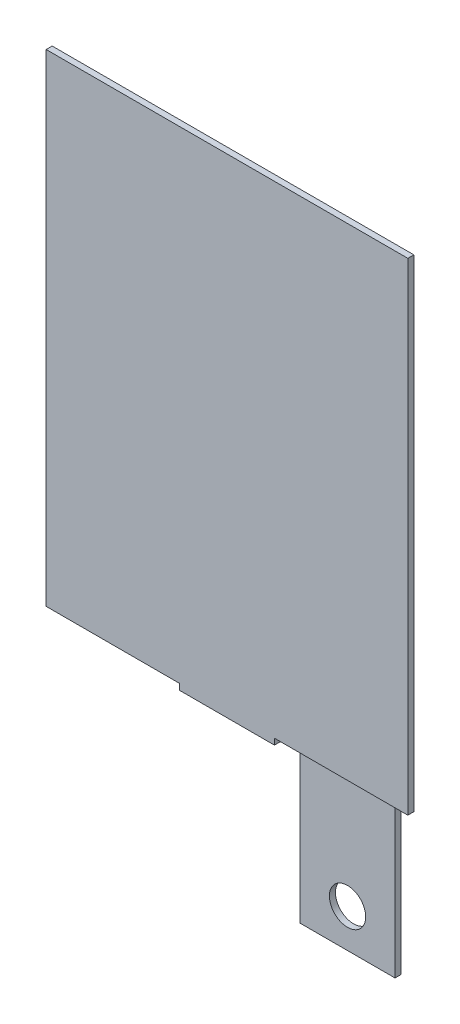
ISO-10303-21;
HEADER;
FILE_DESCRIPTION(('STEP AP214'),'2;1');
FILE_NAME('part.step','',(''),(''),'','','');
FILE_SCHEMA(('AUTOMOTIVE_DESIGN { 1 0 10303 214 1 1 1 1 }'));
ENDSEC;
DATA;
#1=APPLICATION_CONTEXT('core data for automotive mechanical design processes');
#2=APPLICATION_PROTOCOL_DEFINITION('international standard','automotive_design',2000,#1);
#3=PRODUCT_CONTEXT('',#1,'mechanical');
#4=PRODUCT('Part','Part','',(#3));
#5=PRODUCT_RELATED_PRODUCT_CATEGORY('part','',(#4));
#6=PRODUCT_DEFINITION_FORMATION('','',#4);
#7=PRODUCT_DEFINITION_CONTEXT('part definition',#1,'design');
#8=PRODUCT_DEFINITION('design','',#6,#7);
#9=PRODUCT_DEFINITION_SHAPE('','',#8);
#10=(LENGTH_UNIT() NAMED_UNIT(*) SI_UNIT(.MILLI.,.METRE.));
#11=(NAMED_UNIT(*) PLANE_ANGLE_UNIT() SI_UNIT($,.RADIAN.));
#12=(NAMED_UNIT(*) SI_UNIT($,.STERADIAN.) SOLID_ANGLE_UNIT());
#13=UNCERTAINTY_MEASURE_WITH_UNIT(LENGTH_MEASURE(1.E-05),#10,'distance_accuracy_value','');
#14=(GEOMETRIC_REPRESENTATION_CONTEXT(3) GLOBAL_UNCERTAINTY_ASSIGNED_CONTEXT((#13)) GLOBAL_UNIT_ASSIGNED_CONTEXT((#10,
#11,#12)) REPRESENTATION_CONTEXT('',''));
#15=CARTESIAN_POINT('',(0.,0.,0.));
#16=DIRECTION('',(0.,0.,1.));
#17=DIRECTION('',(1.,0.,0.));
#18=AXIS2_PLACEMENT_3D('',#15,#16,#17);
#19=CARTESIAN_POINT('',(3.937,130.048,0.5));
#20=DIRECTION('',(0.,-1.,0.));
#21=DIRECTION('',(0.,0.,-1.));
#22=AXIS2_PLACEMENT_3D('',#19,#20,#21);
#23=PLANE('',#22);
#24=DIRECTION('',(-1.,0.,0.));
#25=VECTOR('',#24,1.);
#26=CARTESIAN_POINT('',(-15.,130.048,10.));
#27=LINE('',#26,#25);
#28=CARTESIAN_POINT('',(3.937,130.048,10.));
#29=VERTEX_POINT('',#28);
#30=CARTESIAN_POINT('',(-3.937,130.048,10.));
#31=VERTEX_POINT('',#30);
#32=EDGE_CURVE('E11',#29,#31,#27,.T.);
#33=ORIENTED_EDGE('',*,*,#32,.F.);
#34=DIRECTION('',(0.,0.,-1.));
#35=VECTOR('',#34,1.);
#36=CARTESIAN_POINT('',(3.937,130.048,0.5));
#37=LINE('',#36,#35);
#38=CARTESIAN_POINT('',(3.937,130.048,0.));
#39=VERTEX_POINT('',#38);
#40=EDGE_CURVE('E181',#29,#39,#37,.T.);
#41=ORIENTED_EDGE('',*,*,#40,.T.);
#42=DIRECTION('',(-1.,0.,0.));
#43=VECTOR('',#42,1.);
#44=CARTESIAN_POINT('',(3.937,130.048,0.));
#45=LINE('',#44,#43);
#46=CARTESIAN_POINT('',(-3.937,130.048,0.));
#47=VERTEX_POINT('',#46);
#48=EDGE_CURVE('E215',#39,#47,#45,.T.);
#49=ORIENTED_EDGE('',*,*,#48,.T.);
#50=DIRECTION('',(0.,0.,-1.));
#51=VECTOR('',#50,1.);
#52=CARTESIAN_POINT('',(-3.937,130.048,0.5));
#53=LINE('',#52,#51);
#54=EDGE_CURVE('E194',#31,#47,#53,.T.);
#55=ORIENTED_EDGE('',*,*,#54,.F.);
#56=EDGE_LOOP('',(#33,#41,#49,#55));
#57=FACE_BOUND('',#56,.T.);
#58=ADVANCED_FACE('F34',(#57),#23,.F.);
#59=CARTESIAN_POINT('',(3.937,130.048,0.5));
#60=DIRECTION('',(0.,0.,1.));
#61=DIRECTION('',(1.,0.,0.));
#62=AXIS2_PLACEMENT_3D('',#59,#60,#61);
#63=PLANE('',#62);
#64=DIRECTION('',(1.,0.,0.));
#65=VECTOR('',#64,1.);
#66=CARTESIAN_POINT('',(-3.937,129.548,0.5));
#67=LINE('',#66,#65);
#68=CARTESIAN_POINT('',(-3.937,129.548,0.5));
#69=VERTEX_POINT('',#68);
#70=CARTESIAN_POINT('',(3.937,129.548,0.5));
#71=VERTEX_POINT('',#70);
#72=EDGE_CURVE('E59',#69,#71,#67,.T.);
#73=ORIENTED_EDGE('',*,*,#72,.F.);
#74=DIRECTION('',(0.,-1.,0.));
#75=VECTOR('',#74,1.);
#76=CARTESIAN_POINT('',(-3.937,107.823,0.5));
#77=LINE('',#76,#75);
#78=CARTESIAN_POINT('',(-3.937,107.823,0.5));
#79=VERTEX_POINT('',#78);
#80=EDGE_CURVE('E200',#69,#79,#77,.T.);
#81=ORIENTED_EDGE('',*,*,#80,.T.);
#82=DIRECTION('',(1.,0.,0.));
#83=VECTOR('',#82,1.);
#84=CARTESIAN_POINT('',(3.937,107.823,0.5));
#85=LINE('',#84,#83);
#86=CARTESIAN_POINT('',(3.937,107.823,0.5));
#87=VERTEX_POINT('',#86);
#88=EDGE_CURVE('E209',#79,#87,#85,.T.);
#89=ORIENTED_EDGE('',*,*,#88,.T.);
#90=DIRECTION('',(0.,1.,0.));
#91=VECTOR('',#90,1.);
#92=CARTESIAN_POINT('',(3.937,107.823,0.5));
#93=LINE('',#92,#91);
#94=EDGE_CURVE('E197',#87,#71,#93,.T.);
#95=ORIENTED_EDGE('',*,*,#94,.T.);
#96=EDGE_LOOP('',(#73,#81,#89,#95));
#97=FACE_BOUND('',#96,.T.);
#98=CARTESIAN_POINT('',(0.,123.698,0.5));
#99=DIRECTION('',(0.,0.,1.));
#100=DIRECTION('',(1.,0.,0.));
#101=AXIS2_PLACEMENT_3D('',#98,#99,#100);
#102=CIRCLE('',#101,1.50448034599741);
#103=CARTESIAN_POINT('',(1.50448034599741,123.698,0.5));
#104=VERTEX_POINT('',#103);
#105=EDGE_CURVE('E216',#104,#104,#102,.T.);
#106=ORIENTED_EDGE('',*,*,#105,.F.);
#107=EDGE_LOOP('',(#106));
#108=FACE_BOUND('',#107,.T.);
#109=CARTESIAN_POINT('',(0.,110.998,0.5));
#110=DIRECTION('',(0.,0.,1.));
#111=DIRECTION('',(1.,0.,0.));
#112=AXIS2_PLACEMENT_3D('',#109,#110,#111);
#113=CIRCLE('',#112,1.50448034599741);
#114=CARTESIAN_POINT('',(1.50448034599741,110.998,0.5));
#115=VERTEX_POINT('',#114);
#116=EDGE_CURVE('E240',#115,#115,#113,.T.);
#117=ORIENTED_EDGE('',*,*,#116,.F.);
#118=EDGE_LOOP('',(#117));
#119=FACE_BOUND('',#118,.T.);
#120=ADVANCED_FACE('F279',(#97,#108,#119),#63,.T.);
#121=CARTESIAN_POINT('',(3.937,130.048,0.));
#122=DIRECTION('',(0.,0.,1.));
#123=DIRECTION('',(1.,0.,0.));
#124=AXIS2_PLACEMENT_3D('',#121,#122,#123);
#125=PLANE('',#124);
#126=CARTESIAN_POINT('',(0.,123.698,0.));
#127=DIRECTION('',(0.,0.,1.));
#128=DIRECTION('',(1.,0.,0.));
#129=AXIS2_PLACEMENT_3D('',#126,#127,#128);
#130=CIRCLE('',#129,1.50448034599741);
#131=CARTESIAN_POINT('',(1.50448034599741,123.698,0.));
#132=VERTEX_POINT('',#131);
#133=EDGE_CURVE('E205',#132,#132,#130,.T.);
#134=ORIENTED_EDGE('',*,*,#133,.T.);
#135=EDGE_LOOP('',(#134));
#136=FACE_BOUND('',#135,.T.);
#137=DIRECTION('',(0.,1.,0.));
#138=VECTOR('',#137,1.);
#139=CARTESIAN_POINT('',(3.937,107.823,0.));
#140=LINE('',#139,#138);
#141=CARTESIAN_POINT('',(3.937,107.823,0.));
#142=VERTEX_POINT('',#141);
#143=EDGE_CURVE('E212',#142,#39,#140,.T.);
#144=ORIENTED_EDGE('',*,*,#143,.F.);
#145=DIRECTION('',(1.,0.,0.));
#146=VECTOR('',#145,1.);
#147=CARTESIAN_POINT('',(3.937,107.823,0.));
#148=LINE('',#147,#146);
#149=CARTESIAN_POINT('',(-3.937,107.823,0.));
#150=VERTEX_POINT('',#149);
#151=EDGE_CURVE('E201',#150,#142,#148,.T.);
#152=ORIENTED_EDGE('',*,*,#151,.F.);
#153=DIRECTION('',(0.,-1.,0.));
#154=VECTOR('',#153,1.);
#155=CARTESIAN_POINT('',(-3.937,107.823,0.));
#156=LINE('',#155,#154);
#157=EDGE_CURVE('E219',#47,#150,#156,.T.);
#158=ORIENTED_EDGE('',*,*,#157,.F.);
#159=ORIENTED_EDGE('',*,*,#48,.F.);
#160=EDGE_LOOP('',(#144,#152,#158,#159));
#161=FACE_BOUND('',#160,.T.);
#162=CARTESIAN_POINT('',(0.,110.998,0.));
#163=DIRECTION('',(0.,0.,1.));
#164=DIRECTION('',(1.,0.,0.));
#165=AXIS2_PLACEMENT_3D('',#162,#163,#164);
#166=CIRCLE('',#165,1.50448034599741);
#167=CARTESIAN_POINT('',(1.50448034599741,110.998,0.));
#168=VERTEX_POINT('',#167);
#169=EDGE_CURVE('E248',#168,#168,#166,.T.);
#170=ORIENTED_EDGE('',*,*,#169,.T.);
#171=EDGE_LOOP('',(#170));
#172=FACE_BOUND('',#171,.T.);
#173=ADVANCED_FACE('F260',(#136,#161,#172),#125,.F.);
#174=CARTESIAN_POINT('',(3.937,107.823,0.5));
#175=DIRECTION('',(-1.,0.,0.));
#176=DIRECTION('',(0.,0.,1.));
#177=AXIS2_PLACEMENT_3D('',#174,#175,#176);
#178=PLANE('',#177);
#179=ORIENTED_EDGE('',*,*,#143,.T.);
#180=ORIENTED_EDGE('',*,*,#40,.F.);
#181=CARTESIAN_POINT('',(3.937,130.048,10.5));
#182=VERTEX_POINT('',#181);
#183=EDGE_CURVE('E43',#182,#29,#37,.T.);
#184=ORIENTED_EDGE('',*,*,#183,.F.);
#185=DIRECTION('',(0.,1.,0.));
#186=VECTOR('',#185,1.);
#187=CARTESIAN_POINT('',(3.937,130.048,10.5));
#188=LINE('',#187,#186);
#189=CARTESIAN_POINT('',(3.937,129.548,10.5));
#190=VERTEX_POINT('',#189);
#191=EDGE_CURVE('E189',#190,#182,#188,.T.);
#192=ORIENTED_EDGE('',*,*,#191,.F.);
#193=DIRECTION('',(0.,0.,-1.));
#194=VECTOR('',#193,1.);
#195=CARTESIAN_POINT('',(3.937,129.548,10.5));
#196=LINE('',#195,#194);
#197=EDGE_CURVE('E236',#190,#71,#196,.T.);
#198=ORIENTED_EDGE('',*,*,#197,.T.);
#199=ORIENTED_EDGE('',*,*,#94,.F.);
#200=DIRECTION('',(0.,0.,-1.));
#201=VECTOR('',#200,1.);
#202=CARTESIAN_POINT('',(3.937,107.823,0.5));
#203=LINE('',#202,#201);
#204=EDGE_CURVE('E211',#87,#142,#203,.T.);
#205=ORIENTED_EDGE('',*,*,#204,.T.);
#206=EDGE_LOOP('',(#179,#180,#184,#192,#198,#199,#205));
#207=FACE_BOUND('',#206,.T.);
#208=ADVANCED_FACE('F36',(#207),#178,.F.);
#209=CARTESIAN_POINT('',(-3.937,107.823,0.5));
#210=DIRECTION('',(1.,0.,0.));
#211=DIRECTION('',(0.,0.,-1.));
#212=AXIS2_PLACEMENT_3D('',#209,#210,#211);
#213=PLANE('',#212);
#214=ORIENTED_EDGE('',*,*,#157,.T.);
#215=DIRECTION('',(0.,0.,-1.));
#216=VECTOR('',#215,1.);
#217=CARTESIAN_POINT('',(-3.937,107.823,0.5));
#218=LINE('',#217,#216);
#219=EDGE_CURVE('E223',#79,#150,#218,.T.);
#220=ORIENTED_EDGE('',*,*,#219,.F.);
#221=ORIENTED_EDGE('',*,*,#80,.F.);
#222=DIRECTION('',(0.,0.,-1.));
#223=VECTOR('',#222,1.);
#224=CARTESIAN_POINT('',(-3.937,129.548,10.5));
#225=LINE('',#224,#223);
#226=CARTESIAN_POINT('',(-3.937,129.548,10.5));
#227=VERTEX_POINT('',#226);
#228=EDGE_CURVE('E245',#227,#69,#225,.T.);
#229=ORIENTED_EDGE('',*,*,#228,.F.);
#230=DIRECTION('',(0.,-1.,0.));
#231=VECTOR('',#230,1.);
#232=CARTESIAN_POINT('',(-3.937,130.048,10.5));
#233=LINE('',#232,#231);
#234=CARTESIAN_POINT('',(-3.937,130.048,10.5));
#235=VERTEX_POINT('',#234);
#236=EDGE_CURVE('E147',#235,#227,#233,.T.);
#237=ORIENTED_EDGE('',*,*,#236,.F.);
#238=EDGE_CURVE('E183',#235,#31,#53,.T.);
#239=ORIENTED_EDGE('',*,*,#238,.T.);
#240=ORIENTED_EDGE('',*,*,#54,.T.);
#241=EDGE_LOOP('',(#214,#220,#221,#229,#237,#239,#240));
#242=FACE_BOUND('',#241,.T.);
#243=ADVANCED_FACE('F275',(#242),#213,.F.);
#244=CARTESIAN_POINT('',(3.937,107.823,0.5));
#245=DIRECTION('',(0.,1.,0.));
#246=DIRECTION('',(0.,0.,1.));
#247=AXIS2_PLACEMENT_3D('',#244,#245,#246);
#248=PLANE('',#247);
#249=ORIENTED_EDGE('',*,*,#151,.T.);
#250=ORIENTED_EDGE('',*,*,#204,.F.);
#251=ORIENTED_EDGE('',*,*,#88,.F.);
#252=ORIENTED_EDGE('',*,*,#219,.T.);
#253=EDGE_LOOP('',(#249,#250,#251,#252));
#254=FACE_BOUND('',#253,.T.);
#255=ADVANCED_FACE('F266',(#254),#248,.F.);
#256=CARTESIAN_POINT('',(0.,123.698,0.5));
#257=DIRECTION('',(0.,0.,-1.));
#258=DIRECTION('',(-1.,0.,0.));
#259=AXIS2_PLACEMENT_3D('',#256,#257,#258);
#260=CYLINDRICAL_SURFACE('',#259,1.50448034599741);
#261=ORIENTED_EDGE('',*,*,#105,.T.);
#262=EDGE_LOOP('',(#261));
#263=FACE_BOUND('',#262,.T.);
#264=ORIENTED_EDGE('',*,*,#133,.F.);
#265=EDGE_LOOP('',(#264));
#266=FACE_BOUND('',#265,.T.);
#267=ADVANCED_FACE('F263',(#263,#266),#260,.F.);
#268=CARTESIAN_POINT('',(0.,110.998,0.5));
#269=DIRECTION('',(0.,0.,-1.));
#270=DIRECTION('',(-1.,0.,0.));
#271=AXIS2_PLACEMENT_3D('',#268,#269,#270);
#272=CYLINDRICAL_SURFACE('',#271,1.50448034599741);
#273=ORIENTED_EDGE('',*,*,#116,.T.);
#274=EDGE_LOOP('',(#273));
#275=FACE_BOUND('',#274,.T.);
#276=ORIENTED_EDGE('',*,*,#169,.F.);
#277=EDGE_LOOP('',(#276));
#278=FACE_BOUND('',#277,.T.);
#279=ADVANCED_FACE('F265',(#275,#278),#272,.F.);
#280=CARTESIAN_POINT('',(-3.937,129.548,10.5));
#281=DIRECTION('',(0.,1.,0.));
#282=DIRECTION('',(0.,0.,1.));
#283=AXIS2_PLACEMENT_3D('',#280,#281,#282);
#284=PLANE('',#283);
#285=ORIENTED_EDGE('',*,*,#72,.T.);
#286=ORIENTED_EDGE('',*,*,#197,.F.);
#287=DIRECTION('',(1.,0.,0.));
#288=VECTOR('',#287,1.);
#289=CARTESIAN_POINT('',(-3.937,129.548,10.5));
#290=LINE('',#289,#288);
#291=EDGE_CURVE('E233',#227,#190,#290,.T.);
#292=ORIENTED_EDGE('',*,*,#291,.F.);
#293=ORIENTED_EDGE('',*,*,#228,.T.);
#294=EDGE_LOOP('',(#285,#286,#292,#293));
#295=FACE_BOUND('',#294,.T.);
#296=ADVANCED_FACE('F272',(#295),#284,.F.);
#297=CARTESIAN_POINT('',(-3.937,129.548,10.5));
#298=DIRECTION('',(0.,0.,1.));
#299=DIRECTION('',(1.,0.,0.));
#300=AXIS2_PLACEMENT_3D('',#297,#298,#299);
#301=PLANE('',#300);
#302=ORIENTED_EDGE('',*,*,#236,.T.);
#303=ORIENTED_EDGE('',*,*,#291,.T.);
#304=ORIENTED_EDGE('',*,*,#191,.T.);
#305=DIRECTION('',(1.,0.,0.));
#306=VECTOR('',#305,1.);
#307=CARTESIAN_POINT('',(-15.,130.048,10.5));
#308=LINE('',#307,#306);
#309=CARTESIAN_POINT('',(15.,130.048,10.5));
#310=VERTEX_POINT('',#309);
#311=EDGE_CURVE('E157',#182,#310,#308,.T.);
#312=ORIENTED_EDGE('',*,*,#311,.T.);
#313=DIRECTION('',(0.,-1.,0.));
#314=VECTOR('',#313,1.);
#315=CARTESIAN_POINT('',(15.,170.048,10.5));
#316=LINE('',#315,#314);
#317=CARTESIAN_POINT('',(15.,170.048,10.5));
#318=VERTEX_POINT('',#317);
#319=EDGE_CURVE('E129',#318,#310,#316,.T.);
#320=ORIENTED_EDGE('',*,*,#319,.F.);
#321=DIRECTION('',(1.,0.,0.));
#322=VECTOR('',#321,1.);
#323=CARTESIAN_POINT('',(-15.,170.048,10.5));
#324=LINE('',#323,#322);
#325=CARTESIAN_POINT('',(-15.,170.048,10.5));
#326=VERTEX_POINT('',#325);
#327=EDGE_CURVE('E120',#326,#318,#324,.T.);
#328=ORIENTED_EDGE('',*,*,#327,.F.);
#329=DIRECTION('',(0.,-1.,0.));
#330=VECTOR('',#329,1.);
#331=CARTESIAN_POINT('',(-15.,170.048,10.5));
#332=LINE('',#331,#330);
#333=CARTESIAN_POINT('',(-15.,130.048,10.5));
#334=VERTEX_POINT('',#333);
#335=EDGE_CURVE('E126',#326,#334,#332,.T.);
#336=ORIENTED_EDGE('',*,*,#335,.T.);
#337=EDGE_CURVE('E153',#334,#235,#308,.T.);
#338=ORIENTED_EDGE('',*,*,#337,.T.);
#339=EDGE_LOOP('',(#302,#303,#304,#312,#320,#328,#336,#338));
#340=FACE_BOUND('',#339,.T.);
#341=ADVANCED_FACE('F123',(#340),#301,.T.);
#342=CARTESIAN_POINT('',(-15.,130.048,10.));
#343=DIRECTION('',(0.,-1.,0.));
#344=DIRECTION('',(0.,0.,-1.));
#345=AXIS2_PLACEMENT_3D('',#342,#343,#344);
#346=PLANE('',#345);
#347=ORIENTED_EDGE('',*,*,#238,.F.);
#348=ORIENTED_EDGE('',*,*,#337,.F.);
#349=DIRECTION('',(0.,0.,1.));
#350=VECTOR('',#349,1.);
#351=CARTESIAN_POINT('',(-15.,130.048,10.5));
#352=LINE('',#351,#350);
#353=CARTESIAN_POINT('',(-15.,130.048,10.));
#354=VERTEX_POINT('',#353);
#355=EDGE_CURVE('E145',#354,#334,#352,.T.);
#356=ORIENTED_EDGE('',*,*,#355,.F.);
#357=EDGE_CURVE('E46',#31,#354,#27,.T.);
#358=ORIENTED_EDGE('',*,*,#357,.F.);
#359=EDGE_LOOP('',(#347,#348,#356,#358));
#360=FACE_BOUND('',#359,.T.);
#361=ADVANCED_FACE('F299',(#360),#346,.T.);
#362=CARTESIAN_POINT('',(-15.,170.048,10.5));
#363=DIRECTION('',(1.,0.,0.));
#364=DIRECTION('',(0.,0.,-1.));
#365=AXIS2_PLACEMENT_3D('',#362,#363,#364);
#366=PLANE('',#365);
#367=ORIENTED_EDGE('',*,*,#355,.T.);
#368=ORIENTED_EDGE('',*,*,#335,.F.);
#369=DIRECTION('',(0.,0.,1.));
#370=VECTOR('',#369,1.);
#371=CARTESIAN_POINT('',(-15.,170.048,10.5));
#372=LINE('',#371,#370);
#373=CARTESIAN_POINT('',(-15.,170.048,10.));
#374=VERTEX_POINT('',#373);
#375=EDGE_CURVE('E133',#374,#326,#372,.T.);
#376=ORIENTED_EDGE('',*,*,#375,.F.);
#377=DIRECTION('',(0.,-1.,0.));
#378=VECTOR('',#377,1.);
#379=CARTESIAN_POINT('',(-15.,170.048,10.));
#380=LINE('',#379,#378);
#381=EDGE_CURVE('E166',#374,#354,#380,.T.);
#382=ORIENTED_EDGE('',*,*,#381,.T.);
#383=EDGE_LOOP('',(#367,#368,#376,#382));
#384=FACE_BOUND('',#383,.T.);
#385=ADVANCED_FACE('F143',(#384),#366,.F.);
#386=CARTESIAN_POINT('',(15.,170.048,10.5));
#387=DIRECTION('',(-1.,0.,0.));
#388=DIRECTION('',(0.,0.,1.));
#389=AXIS2_PLACEMENT_3D('',#386,#387,#388);
#390=PLANE('',#389);
#391=DIRECTION('',(0.,0.,-1.));
#392=VECTOR('',#391,1.);
#393=CARTESIAN_POINT('',(15.,130.048,10.5));
#394=LINE('',#393,#392);
#395=CARTESIAN_POINT('',(15.,130.048,10.));
#396=VERTEX_POINT('',#395);
#397=EDGE_CURVE('E156',#310,#396,#394,.T.);
#398=ORIENTED_EDGE('',*,*,#397,.T.);
#399=DIRECTION('',(0.,-1.,0.));
#400=VECTOR('',#399,1.);
#401=CARTESIAN_POINT('',(15.,170.048,10.));
#402=LINE('',#401,#400);
#403=CARTESIAN_POINT('',(15.,170.048,10.));
#404=VERTEX_POINT('',#403);
#405=EDGE_CURVE('E149',#404,#396,#402,.T.);
#406=ORIENTED_EDGE('',*,*,#405,.F.);
#407=DIRECTION('',(0.,0.,-1.));
#408=VECTOR('',#407,1.);
#409=CARTESIAN_POINT('',(15.,170.048,10.5));
#410=LINE('',#409,#408);
#411=EDGE_CURVE('E132',#318,#404,#410,.T.);
#412=ORIENTED_EDGE('',*,*,#411,.F.);
#413=ORIENTED_EDGE('',*,*,#319,.T.);
#414=EDGE_LOOP('',(#398,#406,#412,#413));
#415=FACE_BOUND('',#414,.T.);
#416=ADVANCED_FACE('F300',(#415),#390,.F.);
#417=CARTESIAN_POINT('',(-15.,170.048,10.));
#418=DIRECTION('',(0.,0.,1.));
#419=DIRECTION('',(1.,0.,0.));
#420=AXIS2_PLACEMENT_3D('',#417,#418,#419);
#421=PLANE('',#420);
#422=EDGE_CURVE('E45',#396,#29,#27,.T.);
#423=ORIENTED_EDGE('',*,*,#422,.T.);
#424=ORIENTED_EDGE('',*,*,#32,.T.);
#425=ORIENTED_EDGE('',*,*,#357,.T.);
#426=ORIENTED_EDGE('',*,*,#381,.F.);
#427=DIRECTION('',(-1.,0.,0.));
#428=VECTOR('',#427,1.);
#429=CARTESIAN_POINT('',(-15.,170.048,10.));
#430=LINE('',#429,#428);
#431=EDGE_CURVE('E138',#404,#374,#430,.T.);
#432=ORIENTED_EDGE('',*,*,#431,.F.);
#433=ORIENTED_EDGE('',*,*,#405,.T.);
#434=EDGE_LOOP('',(#423,#424,#425,#426,#432,#433));
#435=FACE_BOUND('',#434,.T.);
#436=ADVANCED_FACE('F171',(#435),#421,.F.);
#437=CARTESIAN_POINT('',(-15.,170.048,10.));
#438=DIRECTION('',(0.,-1.,0.));
#439=DIRECTION('',(0.,0.,-1.));
#440=AXIS2_PLACEMENT_3D('',#437,#438,#439);
#441=PLANE('',#440);
#442=ORIENTED_EDGE('',*,*,#375,.T.);
#443=ORIENTED_EDGE('',*,*,#327,.T.);
#444=ORIENTED_EDGE('',*,*,#411,.T.);
#445=ORIENTED_EDGE('',*,*,#431,.T.);
#446=EDGE_LOOP('',(#442,#443,#444,#445));
#447=FACE_BOUND('',#446,.T.);
#448=ADVANCED_FACE('F136',(#447),#441,.F.);
#449=ORIENTED_EDGE('',*,*,#311,.F.);
#450=ORIENTED_EDGE('',*,*,#183,.T.);
#451=ORIENTED_EDGE('',*,*,#422,.F.);
#452=ORIENTED_EDGE('',*,*,#397,.F.);
#453=EDGE_LOOP('',(#449,#450,#451,#452));
#454=FACE_BOUND('',#453,.T.);
#455=ADVANCED_FACE('F177',(#454),#346,.T.);
#456=CLOSED_SHELL('',(#58,#120,#173,#208,#243,#255,#267,#279,#296,#341,#361,#385,#416,#436,#448,#455));
#457=MANIFOLD_SOLID_BREP('B2',#456);
#458=ADVANCED_BREP_SHAPE_REPRESENTATION('',(#18,#457),#14);
#459=SHAPE_DEFINITION_REPRESENTATION(#9,#458);
ENDSEC;
END-ISO-10303-21;
